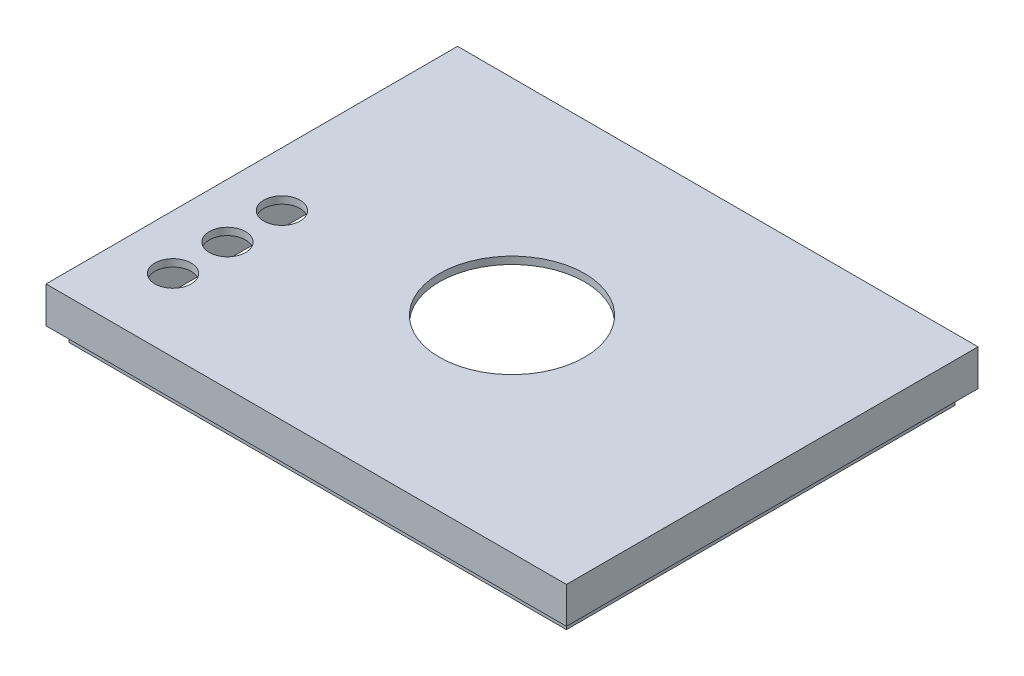
ISO-10303-21;
HEADER;
FILE_DESCRIPTION(('STEP AP214'),'2;1');
FILE_NAME('part.step','',(''),(''),'','','');
FILE_SCHEMA(('AUTOMOTIVE_DESIGN { 1 0 10303 214 1 1 1 1 }'));
ENDSEC;
DATA;
#1=APPLICATION_CONTEXT('core data for automotive mechanical design processes');
#2=APPLICATION_PROTOCOL_DEFINITION('international standard','automotive_design',2000,#1);
#3=PRODUCT_CONTEXT('',#1,'mechanical');
#4=PRODUCT('Part','Part','',(#3));
#5=PRODUCT_RELATED_PRODUCT_CATEGORY('part','',(#4));
#6=PRODUCT_DEFINITION_FORMATION('','',#4);
#7=PRODUCT_DEFINITION_CONTEXT('part definition',#1,'design');
#8=PRODUCT_DEFINITION('design','',#6,#7);
#9=PRODUCT_DEFINITION_SHAPE('','',#8);
#10=(LENGTH_UNIT() NAMED_UNIT(*) SI_UNIT(.MILLI.,.METRE.));
#11=(NAMED_UNIT(*) PLANE_ANGLE_UNIT() SI_UNIT($,.RADIAN.));
#12=(NAMED_UNIT(*) SI_UNIT($,.STERADIAN.) SOLID_ANGLE_UNIT());
#13=UNCERTAINTY_MEASURE_WITH_UNIT(LENGTH_MEASURE(1.E-05),#10,'distance_accuracy_value','');
#14=(GEOMETRIC_REPRESENTATION_CONTEXT(3) GLOBAL_UNCERTAINTY_ASSIGNED_CONTEXT((#13)) GLOBAL_UNIT_ASSIGNED_CONTEXT((#10,
#11,#12)) REPRESENTATION_CONTEXT('',''));
#15=CARTESIAN_POINT('',(0.,0.,0.));
#16=DIRECTION('',(0.,0.,1.));
#17=DIRECTION('',(1.,0.,0.));
#18=AXIS2_PLACEMENT_3D('',#15,#16,#17);
#19=CARTESIAN_POINT('',(0.,0.,0.));
#20=DIRECTION('',(0.,-1.,0.));
#21=DIRECTION('',(0.,0.,-1.));
#22=AXIS2_PLACEMENT_3D('',#19,#20,#21);
#23=PLANE('',#22);
#24=DIRECTION('',(0.,0.,1.));
#25=VECTOR('',#24,1.);
#26=CARTESIAN_POINT('',(-24.5049996269621,0.,34.5619605642785));
#27=LINE('',#26,#25);
#28=CARTESIAN_POINT('',(-24.5049996269621,0.,-22.1380394357215));
#29=VERTEX_POINT('',#28);
#30=CARTESIAN_POINT('',(-24.5049996269621,0.,34.5619605642785));
#31=VERTEX_POINT('',#30);
#32=EDGE_CURVE('E205',#29,#31,#27,.T.);
#33=ORIENTED_EDGE('',*,*,#32,.F.);
#34=DIRECTION('',(-1.,0.,0.));
#35=VECTOR('',#34,1.);
#36=CARTESIAN_POINT('',(-24.5049996269621,0.,-22.1380394357215));
#37=LINE('',#36,#35);
#38=CARTESIAN_POINT('',(47.1950003730378,0.,-22.1380394357215));
#39=VERTEX_POINT('',#38);
#40=EDGE_CURVE('E78',#39,#29,#37,.T.);
#41=ORIENTED_EDGE('',*,*,#40,.F.);
#42=DIRECTION('',(0.,0.,-1.));
#43=VECTOR('',#42,1.);
#44=CARTESIAN_POINT('',(47.1950003730378,0.,34.5619605642785));
#45=LINE('',#44,#43);
#46=CARTESIAN_POINT('',(47.1950003730378,0.,34.5619605642785));
#47=VERTEX_POINT('',#46);
#48=EDGE_CURVE('E217',#47,#39,#45,.T.);
#49=ORIENTED_EDGE('',*,*,#48,.F.);
#50=DIRECTION('',(1.,0.,0.));
#51=VECTOR('',#50,1.);
#52=CARTESIAN_POINT('',(-24.5049996269621,0.,34.5619605642785));
#53=LINE('',#52,#51);
#54=EDGE_CURVE('E215',#31,#47,#53,.T.);
#55=ORIENTED_EDGE('',*,*,#54,.F.);
#56=EDGE_LOOP('',(#33,#41,#49,#55));
#57=FACE_BOUND('',#56,.T.);
#58=DIRECTION('',(1.,0.,0.));
#59=VECTOR('',#58,1.);
#60=CARTESIAN_POINT('',(-22.9049996269621,0.,-20.5380394357215));
#61=LINE('',#60,#59);
#62=CARTESIAN_POINT('',(-22.9049996269621,0.,-20.5380394357215));
#63=VERTEX_POINT('',#62);
#64=CARTESIAN_POINT('',(45.5950003730379,0.,-20.5380394357215));
#65=VERTEX_POINT('',#64);
#66=EDGE_CURVE('E192',#63,#65,#61,.T.);
#67=ORIENTED_EDGE('',*,*,#66,.F.);
#68=DIRECTION('',(0.,0.,-1.));
#69=VECTOR('',#68,1.);
#70=CARTESIAN_POINT('',(-22.9049996269621,0.,32.9619605642785));
#71=LINE('',#70,#69);
#72=CARTESIAN_POINT('',(-22.9049996269621,0.,32.9619605642785));
#73=VERTEX_POINT('',#72);
#74=EDGE_CURVE('E178',#73,#63,#71,.T.);
#75=ORIENTED_EDGE('',*,*,#74,.F.);
#76=DIRECTION('',(-1.,0.,0.));
#77=VECTOR('',#76,1.);
#78=CARTESIAN_POINT('',(-22.9049996269621,0.,32.9619605642785));
#79=LINE('',#78,#77);
#80=CARTESIAN_POINT('',(45.5950003730379,0.,32.9619605642785));
#81=VERTEX_POINT('',#80);
#82=EDGE_CURVE('E183',#81,#73,#79,.T.);
#83=ORIENTED_EDGE('',*,*,#82,.F.);
#84=DIRECTION('',(0.,0.,1.));
#85=VECTOR('',#84,1.);
#86=CARTESIAN_POINT('',(45.5950003730379,0.,32.9619605642785));
#87=LINE('',#86,#85);
#88=EDGE_CURVE('E194',#65,#81,#87,.T.);
#89=ORIENTED_EDGE('',*,*,#88,.F.);
#90=EDGE_LOOP('',(#67,#75,#83,#89));
#91=FACE_BOUND('',#90,.T.);
#92=ADVANCED_FACE('F33',(#57,#91),#23,.T.);
#93=CARTESIAN_POINT('',(-24.5049996269621,5.,34.5619605642785));
#94=DIRECTION('',(1.,0.,0.));
#95=DIRECTION('',(0.,0.,-1.));
#96=AXIS2_PLACEMENT_3D('',#93,#94,#95);
#97=PLANE('',#96);
#98=ORIENTED_EDGE('',*,*,#32,.T.);
#99=DIRECTION('',(0.,-1.,0.));
#100=VECTOR('',#99,1.);
#101=CARTESIAN_POINT('',(-24.5049996269621,5.,34.5619605642785));
#102=LINE('',#101,#100);
#103=CARTESIAN_POINT('',(-24.5049996269621,5.,34.5619605642785));
#104=VERTEX_POINT('',#103);
#105=EDGE_CURVE('E11',#104,#31,#102,.T.);
#106=ORIENTED_EDGE('',*,*,#105,.F.);
#107=DIRECTION('',(0.,0.,1.));
#108=VECTOR('',#107,1.);
#109=CARTESIAN_POINT('',(-24.5049996269621,5.,34.5619605642785));
#110=LINE('',#109,#108);
#111=CARTESIAN_POINT('',(-24.5049996269621,5.,-22.1380394357215));
#112=VERTEX_POINT('',#111);
#113=EDGE_CURVE('E206',#112,#104,#110,.T.);
#114=ORIENTED_EDGE('',*,*,#113,.F.);
#115=DIRECTION('',(0.,-1.,0.));
#116=VECTOR('',#115,1.);
#117=CARTESIAN_POINT('',(-24.5049996269621,5.,-22.1380394357215));
#118=LINE('',#117,#116);
#119=EDGE_CURVE('E212',#112,#29,#118,.T.);
#120=ORIENTED_EDGE('',*,*,#119,.T.);
#121=EDGE_LOOP('',(#98,#106,#114,#120));
#122=FACE_BOUND('',#121,.T.);
#123=ADVANCED_FACE('F35',(#122),#97,.F.);
#124=CARTESIAN_POINT('',(-24.5049996269621,5.,34.5619605642785));
#125=DIRECTION('',(0.,0.,-1.));
#126=DIRECTION('',(-1.,0.,0.));
#127=AXIS2_PLACEMENT_3D('',#124,#125,#126);
#128=PLANE('',#127);
#129=ORIENTED_EDGE('',*,*,#54,.T.);
#130=DIRECTION('',(0.,-1.,0.));
#131=VECTOR('',#130,1.);
#132=CARTESIAN_POINT('',(47.1950003730378,5.,34.5619605642785));
#133=LINE('',#132,#131);
#134=CARTESIAN_POINT('',(47.1950003730378,5.,34.5619605642785));
#135=VERTEX_POINT('',#134);
#136=EDGE_CURVE('E41',#135,#47,#133,.T.);
#137=ORIENTED_EDGE('',*,*,#136,.F.);
#138=DIRECTION('',(1.,0.,0.));
#139=VECTOR('',#138,1.);
#140=CARTESIAN_POINT('',(-24.5049996269621,5.,34.5619605642785));
#141=LINE('',#140,#139);
#142=EDGE_CURVE('E85',#104,#135,#141,.T.);
#143=ORIENTED_EDGE('',*,*,#142,.F.);
#144=ORIENTED_EDGE('',*,*,#105,.T.);
#145=EDGE_LOOP('',(#129,#137,#143,#144));
#146=FACE_BOUND('',#145,.T.);
#147=ADVANCED_FACE('F245',(#146),#128,.F.);
#148=CARTESIAN_POINT('',(47.1950003730378,5.,34.5619605642785));
#149=DIRECTION('',(-1.,0.,0.));
#150=DIRECTION('',(0.,0.,1.));
#151=AXIS2_PLACEMENT_3D('',#148,#149,#150);
#152=PLANE('',#151);
#153=ORIENTED_EDGE('',*,*,#48,.T.);
#154=DIRECTION('',(0.,-1.,0.));
#155=VECTOR('',#154,1.);
#156=CARTESIAN_POINT('',(47.1950003730378,5.,-22.1380394357215));
#157=LINE('',#156,#155);
#158=CARTESIAN_POINT('',(47.1950003730378,5.,-22.1380394357215));
#159=VERTEX_POINT('',#158);
#160=EDGE_CURVE('E221',#159,#39,#157,.T.);
#161=ORIENTED_EDGE('',*,*,#160,.F.);
#162=DIRECTION('',(0.,0.,-1.));
#163=VECTOR('',#162,1.);
#164=CARTESIAN_POINT('',(47.1950003730378,5.,34.5619605642785));
#165=LINE('',#164,#163);
#166=EDGE_CURVE('E209',#135,#159,#165,.T.);
#167=ORIENTED_EDGE('',*,*,#166,.F.);
#168=ORIENTED_EDGE('',*,*,#136,.T.);
#169=EDGE_LOOP('',(#153,#161,#167,#168));
#170=FACE_BOUND('',#169,.T.);
#171=ADVANCED_FACE('F226',(#170),#152,.F.);
#172=CARTESIAN_POINT('',(-24.5049996269621,5.,-22.1380394357215));
#173=DIRECTION('',(0.,0.,1.));
#174=DIRECTION('',(1.,0.,0.));
#175=AXIS2_PLACEMENT_3D('',#172,#173,#174);
#176=PLANE('',#175);
#177=ORIENTED_EDGE('',*,*,#40,.T.);
#178=ORIENTED_EDGE('',*,*,#119,.F.);
#179=DIRECTION('',(-1.,0.,0.));
#180=VECTOR('',#179,1.);
#181=CARTESIAN_POINT('',(-24.5049996269621,5.,-22.1380394357215));
#182=LINE('',#181,#180);
#183=EDGE_CURVE('E57',#159,#112,#182,.T.);
#184=ORIENTED_EDGE('',*,*,#183,.F.);
#185=ORIENTED_EDGE('',*,*,#160,.T.);
#186=EDGE_LOOP('',(#177,#178,#184,#185));
#187=FACE_BOUND('',#186,.T.);
#188=ADVANCED_FACE('F234',(#187),#176,.F.);
#189=CARTESIAN_POINT('',(0.,5.,0.));
#190=DIRECTION('',(0.,-1.,0.));
#191=DIRECTION('',(0.,0.,-1.));
#192=AXIS2_PLACEMENT_3D('',#189,#190,#191);
#193=PLANE('',#192);
#194=CARTESIAN_POINT('',(11.3450003730379,5.,6.21196056427851));
#195=DIRECTION('',(0.,1.,0.));
#196=DIRECTION('',(0.,0.,1.));
#197=AXIS2_PLACEMENT_3D('',#194,#195,#196);
#198=CIRCLE('',#197,10.);
#199=CARTESIAN_POINT('',(11.3450003730379,5.,16.2119605642785));
#200=VERTEX_POINT('',#199);
#201=EDGE_CURVE('E309',#200,#200,#198,.T.);
#202=ORIENTED_EDGE('',*,*,#201,.F.);
#203=EDGE_LOOP('',(#202));
#204=FACE_BOUND('',#203,.T.);
#205=CARTESIAN_POINT('',(-17.0049996269621,5.,9.56196056427851));
#206=DIRECTION('',(0.,1.,0.));
#207=DIRECTION('',(0.,0.,1.));
#208=AXIS2_PLACEMENT_3D('',#205,#206,#207);
#209=CIRCLE('',#208,2.5);
#210=CARTESIAN_POINT('',(-17.0049996269621,5.,12.0619605642785));
#211=VERTEX_POINT('',#210);
#212=EDGE_CURVE('E311',#211,#211,#209,.T.);
#213=ORIENTED_EDGE('',*,*,#212,.F.);
#214=EDGE_LOOP('',(#213));
#215=FACE_BOUND('',#214,.T.);
#216=CARTESIAN_POINT('',(-17.0049996269621,5.,17.0619605642785));
#217=DIRECTION('',(0.,1.,0.));
#218=DIRECTION('',(0.,0.,1.));
#219=AXIS2_PLACEMENT_3D('',#216,#217,#218);
#220=CIRCLE('',#219,2.5);
#221=CARTESIAN_POINT('',(-17.0049996269621,5.,19.5619605642785));
#222=VERTEX_POINT('',#221);
#223=EDGE_CURVE('E317',#222,#222,#220,.T.);
#224=ORIENTED_EDGE('',*,*,#223,.F.);
#225=EDGE_LOOP('',(#224));
#226=FACE_BOUND('',#225,.T.);
#227=CARTESIAN_POINT('',(-17.0049996269621,5.,24.5619605642785));
#228=DIRECTION('',(0.,1.,0.));
#229=DIRECTION('',(0.,0.,1.));
#230=AXIS2_PLACEMENT_3D('',#227,#228,#229);
#231=CIRCLE('',#230,2.5);
#232=CARTESIAN_POINT('',(-17.0049996269621,5.,27.0619605642785));
#233=VERTEX_POINT('',#232);
#234=EDGE_CURVE('E161',#233,#233,#231,.T.);
#235=ORIENTED_EDGE('',*,*,#234,.F.);
#236=EDGE_LOOP('',(#235));
#237=FACE_BOUND('',#236,.T.);
#238=ORIENTED_EDGE('',*,*,#113,.T.);
#239=ORIENTED_EDGE('',*,*,#142,.T.);
#240=ORIENTED_EDGE('',*,*,#166,.T.);
#241=ORIENTED_EDGE('',*,*,#183,.T.);
#242=EDGE_LOOP('',(#238,#239,#240,#241));
#243=FACE_BOUND('',#242,.T.);
#244=ADVANCED_FACE('F236',(#204,#215,#226,#237,#243),#193,.F.);
#245=CARTESIAN_POINT('',(0.,-2.,0.));
#246=DIRECTION('',(0.,-1.,0.));
#247=DIRECTION('',(0.,0.,-1.));
#248=AXIS2_PLACEMENT_3D('',#245,#246,#247);
#249=PLANE('',#248);
#250=DIRECTION('',(0.,0.,-1.));
#251=VECTOR('',#250,1.);
#252=CARTESIAN_POINT('',(-22.9049996269621,-2.,32.9619605642785));
#253=LINE('',#252,#251);
#254=CARTESIAN_POINT('',(-22.9049996269621,-2.,32.9619605642785));
#255=VERTEX_POINT('',#254);
#256=CARTESIAN_POINT('',(-22.9049996269621,-2.,-20.5380394357215));
#257=VERTEX_POINT('',#256);
#258=EDGE_CURVE('E179',#255,#257,#253,.T.);
#259=ORIENTED_EDGE('',*,*,#258,.T.);
#260=DIRECTION('',(1.,0.,0.));
#261=VECTOR('',#260,1.);
#262=CARTESIAN_POINT('',(-22.9049996269621,-2.,-20.5380394357215));
#263=LINE('',#262,#261);
#264=CARTESIAN_POINT('',(45.5950003730379,-2.,-20.5380394357215));
#265=VERTEX_POINT('',#264);
#266=EDGE_CURVE('E182',#257,#265,#263,.T.);
#267=ORIENTED_EDGE('',*,*,#266,.T.);
#268=DIRECTION('',(0.,0.,1.));
#269=VECTOR('',#268,1.);
#270=CARTESIAN_POINT('',(45.5950003730379,-2.,32.9619605642785));
#271=LINE('',#270,#269);
#272=CARTESIAN_POINT('',(45.5950003730379,-2.,32.9619605642785));
#273=VERTEX_POINT('',#272);
#274=EDGE_CURVE('E185',#265,#273,#271,.T.);
#275=ORIENTED_EDGE('',*,*,#274,.T.);
#276=DIRECTION('',(-1.,0.,0.));
#277=VECTOR('',#276,1.);
#278=CARTESIAN_POINT('',(-22.9049996269621,-2.,32.9619605642785));
#279=LINE('',#278,#277);
#280=EDGE_CURVE('E187',#273,#255,#279,.T.);
#281=ORIENTED_EDGE('',*,*,#280,.T.);
#282=EDGE_LOOP('',(#259,#267,#275,#281));
#283=FACE_BOUND('',#282,.T.);
#284=DIRECTION('',(1.,0.,0.));
#285=VECTOR('',#284,1.);
#286=CARTESIAN_POINT('',(-21.9049996269621,-2.,-19.5380394357215));
#287=LINE('',#286,#285);
#288=CARTESIAN_POINT('',(-21.9049996269621,-2.,-19.5380394357215));
#289=VERTEX_POINT('',#288);
#290=CARTESIAN_POINT('',(44.5950003730379,-2.,-19.5380394357215));
#291=VERTEX_POINT('',#290);
#292=EDGE_CURVE('E169',#289,#291,#287,.T.);
#293=ORIENTED_EDGE('',*,*,#292,.F.);
#294=DIRECTION('',(0.,0.,-1.));
#295=VECTOR('',#294,1.);
#296=CARTESIAN_POINT('',(-21.9049996269621,-2.,31.9619605642785));
#297=LINE('',#296,#295);
#298=CARTESIAN_POINT('',(-21.9049996269621,-2.,31.9619605642785));
#299=VERTEX_POINT('',#298);
#300=EDGE_CURVE('E167',#299,#289,#297,.T.);
#301=ORIENTED_EDGE('',*,*,#300,.F.);
#302=DIRECTION('',(-1.,0.,0.));
#303=VECTOR('',#302,1.);
#304=CARTESIAN_POINT('',(-21.9049996269621,-2.,31.9619605642785));
#305=LINE('',#304,#303);
#306=CARTESIAN_POINT('',(44.5950003730379,-2.,31.9619605642785));
#307=VERTEX_POINT('',#306);
#308=EDGE_CURVE('E172',#307,#299,#305,.T.);
#309=ORIENTED_EDGE('',*,*,#308,.F.);
#310=DIRECTION('',(0.,0.,1.));
#311=VECTOR('',#310,1.);
#312=CARTESIAN_POINT('',(44.5950003730379,-2.,31.9619605642785));
#313=LINE('',#312,#311);
#314=EDGE_CURVE('E140',#291,#307,#313,.T.);
#315=ORIENTED_EDGE('',*,*,#314,.F.);
#316=EDGE_LOOP('',(#293,#301,#309,#315));
#317=FACE_BOUND('',#316,.T.);
#318=ADVANCED_FACE('F242',(#283,#317),#249,.T.);
#319=CARTESIAN_POINT('',(-22.9049996269621,-2.,32.9619605642785));
#320=DIRECTION('',(1.,0.,0.));
#321=DIRECTION('',(0.,0.,-1.));
#322=AXIS2_PLACEMENT_3D('',#319,#320,#321);
#323=PLANE('',#322);
#324=ORIENTED_EDGE('',*,*,#74,.T.);
#325=DIRECTION('',(0.,1.,0.));
#326=VECTOR('',#325,1.);
#327=CARTESIAN_POINT('',(-22.9049996269621,-2.,-20.5380394357215));
#328=LINE('',#327,#326);
#329=EDGE_CURVE('E203',#257,#63,#328,.T.);
#330=ORIENTED_EDGE('',*,*,#329,.F.);
#331=ORIENTED_EDGE('',*,*,#258,.F.);
#332=DIRECTION('',(0.,1.,0.));
#333=VECTOR('',#332,1.);
#334=CARTESIAN_POINT('',(-22.9049996269621,-2.,32.9619605642785));
#335=LINE('',#334,#333);
#336=EDGE_CURVE('E189',#255,#73,#335,.T.);
#337=ORIENTED_EDGE('',*,*,#336,.T.);
#338=EDGE_LOOP('',(#324,#330,#331,#337));
#339=FACE_BOUND('',#338,.T.);
#340=ADVANCED_FACE('F253',(#339),#323,.F.);
#341=CARTESIAN_POINT('',(-22.9049996269621,-2.,-20.5380394357215));
#342=DIRECTION('',(0.,0.,1.));
#343=DIRECTION('',(1.,0.,0.));
#344=AXIS2_PLACEMENT_3D('',#341,#342,#343);
#345=PLANE('',#344);
#346=ORIENTED_EDGE('',*,*,#66,.T.);
#347=DIRECTION('',(0.,1.,0.));
#348=VECTOR('',#347,1.);
#349=CARTESIAN_POINT('',(45.5950003730379,-2.,-20.5380394357215));
#350=LINE('',#349,#348);
#351=EDGE_CURVE('E200',#265,#65,#350,.T.);
#352=ORIENTED_EDGE('',*,*,#351,.F.);
#353=ORIENTED_EDGE('',*,*,#266,.F.);
#354=ORIENTED_EDGE('',*,*,#329,.T.);
#355=EDGE_LOOP('',(#346,#352,#353,#354));
#356=FACE_BOUND('',#355,.T.);
#357=ADVANCED_FACE('F256',(#356),#345,.F.);
#358=CARTESIAN_POINT('',(45.5950003730379,-2.,32.9619605642785));
#359=DIRECTION('',(-1.,0.,0.));
#360=DIRECTION('',(0.,0.,1.));
#361=AXIS2_PLACEMENT_3D('',#358,#359,#360);
#362=PLANE('',#361);
#363=ORIENTED_EDGE('',*,*,#88,.T.);
#364=DIRECTION('',(0.,1.,0.));
#365=VECTOR('',#364,1.);
#366=CARTESIAN_POINT('',(45.5950003730379,-2.,32.9619605642785));
#367=LINE('',#366,#365);
#368=EDGE_CURVE('E48',#273,#81,#367,.T.);
#369=ORIENTED_EDGE('',*,*,#368,.F.);
#370=ORIENTED_EDGE('',*,*,#274,.F.);
#371=ORIENTED_EDGE('',*,*,#351,.T.);
#372=EDGE_LOOP('',(#363,#369,#370,#371));
#373=FACE_BOUND('',#372,.T.);
#374=ADVANCED_FACE('F260',(#373),#362,.F.);
#375=CARTESIAN_POINT('',(-22.9049996269621,-2.,32.9619605642785));
#376=DIRECTION('',(0.,0.,-1.));
#377=DIRECTION('',(-1.,0.,0.));
#378=AXIS2_PLACEMENT_3D('',#375,#376,#377);
#379=PLANE('',#378);
#380=ORIENTED_EDGE('',*,*,#82,.T.);
#381=ORIENTED_EDGE('',*,*,#336,.F.);
#382=ORIENTED_EDGE('',*,*,#280,.F.);
#383=ORIENTED_EDGE('',*,*,#368,.T.);
#384=EDGE_LOOP('',(#380,#381,#382,#383));
#385=FACE_BOUND('',#384,.T.);
#386=ADVANCED_FACE('F264',(#385),#379,.F.);
#387=CARTESIAN_POINT('',(-21.9049996269621,-2.,31.9619605642785));
#388=DIRECTION('',(1.,0.,0.));
#389=DIRECTION('',(0.,0.,-1.));
#390=AXIS2_PLACEMENT_3D('',#387,#388,#389);
#391=PLANE('',#390);
#392=DIRECTION('',(0.,1.,0.));
#393=VECTOR('',#392,1.);
#394=CARTESIAN_POINT('',(-21.9049996269621,-2.,-19.5380394357215));
#395=LINE('',#394,#393);
#396=CARTESIAN_POINT('',(-21.9049996269621,4.,-19.5380394357215));
#397=VERTEX_POINT('',#396);
#398=EDGE_CURVE('E176',#289,#397,#395,.T.);
#399=ORIENTED_EDGE('',*,*,#398,.T.);
#400=DIRECTION('',(0.,0.,-1.));
#401=VECTOR('',#400,1.);
#402=CARTESIAN_POINT('',(-21.9049996269621,4.,0.));
#403=LINE('',#402,#401);
#404=CARTESIAN_POINT('',(-21.9049996269621,4.,31.9619605642785));
#405=VERTEX_POINT('',#404);
#406=EDGE_CURVE('E153',#405,#397,#403,.T.);
#407=ORIENTED_EDGE('',*,*,#406,.F.);
#408=DIRECTION('',(0.,1.,0.));
#409=VECTOR('',#408,1.);
#410=CARTESIAN_POINT('',(-21.9049996269621,-2.,31.9619605642785));
#411=LINE('',#410,#409);
#412=EDGE_CURVE('E144',#299,#405,#411,.T.);
#413=ORIENTED_EDGE('',*,*,#412,.F.);
#414=ORIENTED_EDGE('',*,*,#300,.T.);
#415=EDGE_LOOP('',(#399,#407,#413,#414));
#416=FACE_BOUND('',#415,.T.);
#417=ADVANCED_FACE('F268',(#416),#391,.T.);
#418=CARTESIAN_POINT('',(-21.9049996269621,-2.,-19.5380394357215));
#419=DIRECTION('',(0.,0.,1.));
#420=DIRECTION('',(1.,0.,0.));
#421=AXIS2_PLACEMENT_3D('',#418,#419,#420);
#422=PLANE('',#421);
#423=DIRECTION('',(0.,1.,0.));
#424=VECTOR('',#423,1.);
#425=CARTESIAN_POINT('',(44.5950003730379,-2.,-19.5380394357215));
#426=LINE('',#425,#424);
#427=CARTESIAN_POINT('',(44.5950003730379,4.,-19.5380394357215));
#428=VERTEX_POINT('',#427);
#429=EDGE_CURVE('E143',#291,#428,#426,.T.);
#430=ORIENTED_EDGE('',*,*,#429,.T.);
#431=DIRECTION('',(1.,0.,0.));
#432=VECTOR('',#431,1.);
#433=CARTESIAN_POINT('',(0.,4.,-19.5380394357215));
#434=LINE('',#433,#432);
#435=EDGE_CURVE('E157',#397,#428,#434,.T.);
#436=ORIENTED_EDGE('',*,*,#435,.F.);
#437=ORIENTED_EDGE('',*,*,#398,.F.);
#438=ORIENTED_EDGE('',*,*,#292,.T.);
#439=EDGE_LOOP('',(#430,#436,#437,#438));
#440=FACE_BOUND('',#439,.T.);
#441=ADVANCED_FACE('F274',(#440),#422,.T.);
#442=CARTESIAN_POINT('',(44.5950003730379,-2.,31.9619605642785));
#443=DIRECTION('',(-1.,0.,0.));
#444=DIRECTION('',(0.,0.,1.));
#445=AXIS2_PLACEMENT_3D('',#442,#443,#444);
#446=PLANE('',#445);
#447=DIRECTION('',(0.,1.,0.));
#448=VECTOR('',#447,1.);
#449=CARTESIAN_POINT('',(44.5950003730379,-2.,31.9619605642785));
#450=LINE('',#449,#448);
#451=CARTESIAN_POINT('',(44.5950003730379,4.,31.9619605642785));
#452=VERTEX_POINT('',#451);
#453=EDGE_CURVE('E132',#307,#452,#450,.T.);
#454=ORIENTED_EDGE('',*,*,#453,.T.);
#455=DIRECTION('',(0.,0.,-1.));
#456=VECTOR('',#455,1.);
#457=CARTESIAN_POINT('',(44.5950003730379,4.,0.));
#458=LINE('',#457,#456);
#459=EDGE_CURVE('E137',#452,#428,#458,.T.);
#460=ORIENTED_EDGE('',*,*,#459,.T.);
#461=ORIENTED_EDGE('',*,*,#429,.F.);
#462=ORIENTED_EDGE('',*,*,#314,.T.);
#463=EDGE_LOOP('',(#454,#460,#461,#462));
#464=FACE_BOUND('',#463,.T.);
#465=ADVANCED_FACE('F134',(#464),#446,.T.);
#466=CARTESIAN_POINT('',(-21.9049996269621,-2.,31.9619605642785));
#467=DIRECTION('',(0.,0.,-1.));
#468=DIRECTION('',(-1.,0.,0.));
#469=AXIS2_PLACEMENT_3D('',#466,#467,#468);
#470=PLANE('',#469);
#471=ORIENTED_EDGE('',*,*,#412,.T.);
#472=DIRECTION('',(1.,0.,0.));
#473=VECTOR('',#472,1.);
#474=CARTESIAN_POINT('',(0.,4.,31.9619605642785));
#475=LINE('',#474,#473);
#476=EDGE_CURVE('E147',#405,#452,#475,.T.);
#477=ORIENTED_EDGE('',*,*,#476,.T.);
#478=ORIENTED_EDGE('',*,*,#453,.F.);
#479=ORIENTED_EDGE('',*,*,#308,.T.);
#480=EDGE_LOOP('',(#471,#477,#478,#479));
#481=FACE_BOUND('',#480,.T.);
#482=ADVANCED_FACE('F148',(#481),#470,.T.);
#483=CARTESIAN_POINT('',(0.,4.,0.));
#484=DIRECTION('',(0.,-1.,0.));
#485=DIRECTION('',(0.,0.,-1.));
#486=AXIS2_PLACEMENT_3D('',#483,#484,#485);
#487=PLANE('',#486);
#488=CARTESIAN_POINT('',(11.3450003730379,4.,6.21196056427851));
#489=DIRECTION('',(0.,1.,0.));
#490=DIRECTION('',(0.,0.,1.));
#491=AXIS2_PLACEMENT_3D('',#488,#489,#490);
#492=CIRCLE('',#491,10.);
#493=CARTESIAN_POINT('',(11.3450003730379,4.,16.2119605642785));
#494=VERTEX_POINT('',#493);
#495=EDGE_CURVE('E306',#494,#494,#492,.T.);
#496=ORIENTED_EDGE('',*,*,#495,.T.);
#497=EDGE_LOOP('',(#496));
#498=FACE_BOUND('',#497,.T.);
#499=CARTESIAN_POINT('',(-17.0049996269621,4.,9.56196056427851));
#500=DIRECTION('',(0.,1.,0.));
#501=DIRECTION('',(0.,0.,1.));
#502=AXIS2_PLACEMENT_3D('',#499,#500,#501);
#503=CIRCLE('',#502,2.5);
#504=CARTESIAN_POINT('',(-17.0049996269621,4.,12.0619605642785));
#505=VERTEX_POINT('',#504);
#506=EDGE_CURVE('E314',#505,#505,#503,.T.);
#507=ORIENTED_EDGE('',*,*,#506,.T.);
#508=EDGE_LOOP('',(#507));
#509=FACE_BOUND('',#508,.T.);
#510=CARTESIAN_POINT('',(-17.0049996269621,4.,17.0619605642785));
#511=DIRECTION('',(0.,1.,0.));
#512=DIRECTION('',(0.,0.,1.));
#513=AXIS2_PLACEMENT_3D('',#510,#511,#512);
#514=CIRCLE('',#513,2.5);
#515=CARTESIAN_POINT('',(-17.0049996269621,4.,19.5619605642785));
#516=VERTEX_POINT('',#515);
#517=EDGE_CURVE('E320',#516,#516,#514,.T.);
#518=ORIENTED_EDGE('',*,*,#517,.T.);
#519=EDGE_LOOP('',(#518));
#520=FACE_BOUND('',#519,.T.);
#521=CARTESIAN_POINT('',(-17.0049996269621,4.,24.5619605642785));
#522=DIRECTION('',(0.,1.,0.));
#523=DIRECTION('',(0.,0.,1.));
#524=AXIS2_PLACEMENT_3D('',#521,#522,#523);
#525=CIRCLE('',#524,2.5);
#526=CARTESIAN_POINT('',(-17.0049996269621,4.,27.0619605642785));
#527=VERTEX_POINT('',#526);
#528=EDGE_CURVE('E158',#527,#527,#525,.T.);
#529=ORIENTED_EDGE('',*,*,#528,.T.);
#530=EDGE_LOOP('',(#529));
#531=FACE_BOUND('',#530,.T.);
#532=ORIENTED_EDGE('',*,*,#459,.F.);
#533=ORIENTED_EDGE('',*,*,#476,.F.);
#534=ORIENTED_EDGE('',*,*,#406,.T.);
#535=ORIENTED_EDGE('',*,*,#435,.T.);
#536=EDGE_LOOP('',(#532,#533,#534,#535));
#537=FACE_BOUND('',#536,.T.);
#538=ADVANCED_FACE('F155',(#498,#509,#520,#531,#537),#487,.T.);
#539=CARTESIAN_POINT('',(-17.0049996269621,4.,24.5619605642785));
#540=DIRECTION('',(0.,1.,0.));
#541=DIRECTION('',(0.,0.,1.));
#542=AXIS2_PLACEMENT_3D('',#539,#540,#541);
#543=CYLINDRICAL_SURFACE('',#542,2.5);
#544=ORIENTED_EDGE('',*,*,#528,.F.);
#545=EDGE_LOOP('',(#544));
#546=FACE_BOUND('',#545,.T.);
#547=ORIENTED_EDGE('',*,*,#234,.T.);
#548=EDGE_LOOP('',(#547));
#549=FACE_BOUND('',#548,.T.);
#550=ADVANCED_FACE('F285',(#546,#549),#543,.F.);
#551=CARTESIAN_POINT('',(-17.0049996269621,4.,17.0619605642785));
#552=DIRECTION('',(0.,1.,0.));
#553=DIRECTION('',(0.,0.,1.));
#554=AXIS2_PLACEMENT_3D('',#551,#552,#553);
#555=CYLINDRICAL_SURFACE('',#554,2.5);
#556=ORIENTED_EDGE('',*,*,#517,.F.);
#557=EDGE_LOOP('',(#556));
#558=FACE_BOUND('',#557,.T.);
#559=ORIENTED_EDGE('',*,*,#223,.T.);
#560=EDGE_LOOP('',(#559));
#561=FACE_BOUND('',#560,.T.);
#562=ADVANCED_FACE('F289',(#558,#561),#555,.F.);
#563=CARTESIAN_POINT('',(-17.0049996269621,4.,9.56196056427851));
#564=DIRECTION('',(0.,1.,0.));
#565=DIRECTION('',(0.,0.,1.));
#566=AXIS2_PLACEMENT_3D('',#563,#564,#565);
#567=CYLINDRICAL_SURFACE('',#566,2.5);
#568=ORIENTED_EDGE('',*,*,#506,.F.);
#569=EDGE_LOOP('',(#568));
#570=FACE_BOUND('',#569,.T.);
#571=ORIENTED_EDGE('',*,*,#212,.T.);
#572=EDGE_LOOP('',(#571));
#573=FACE_BOUND('',#572,.T.);
#574=ADVANCED_FACE('F293',(#570,#573),#567,.F.);
#575=CARTESIAN_POINT('',(11.3450003730379,4.,6.21196056427851));
#576=DIRECTION('',(0.,1.,0.));
#577=DIRECTION('',(0.,0.,1.));
#578=AXIS2_PLACEMENT_3D('',#575,#576,#577);
#579=CYLINDRICAL_SURFACE('',#578,10.);
#580=ORIENTED_EDGE('',*,*,#495,.F.);
#581=EDGE_LOOP('',(#580));
#582=FACE_BOUND('',#581,.T.);
#583=ORIENTED_EDGE('',*,*,#201,.T.);
#584=EDGE_LOOP('',(#583));
#585=FACE_BOUND('',#584,.T.);
#586=ADVANCED_FACE('F297',(#582,#585),#579,.F.);
#587=CLOSED_SHELL('',(#92,#123,#147,#171,#188,#244,#318,#340,#357,#374,#386,#417,#441,#465,#482,
#538,#550,#562,#574,#586));
#588=MANIFOLD_SOLID_BREP('B2',#587);
#589=ADVANCED_BREP_SHAPE_REPRESENTATION('',(#18,#588),#14);
#590=SHAPE_DEFINITION_REPRESENTATION(#9,#589);
ENDSEC;
END-ISO-10303-21;
